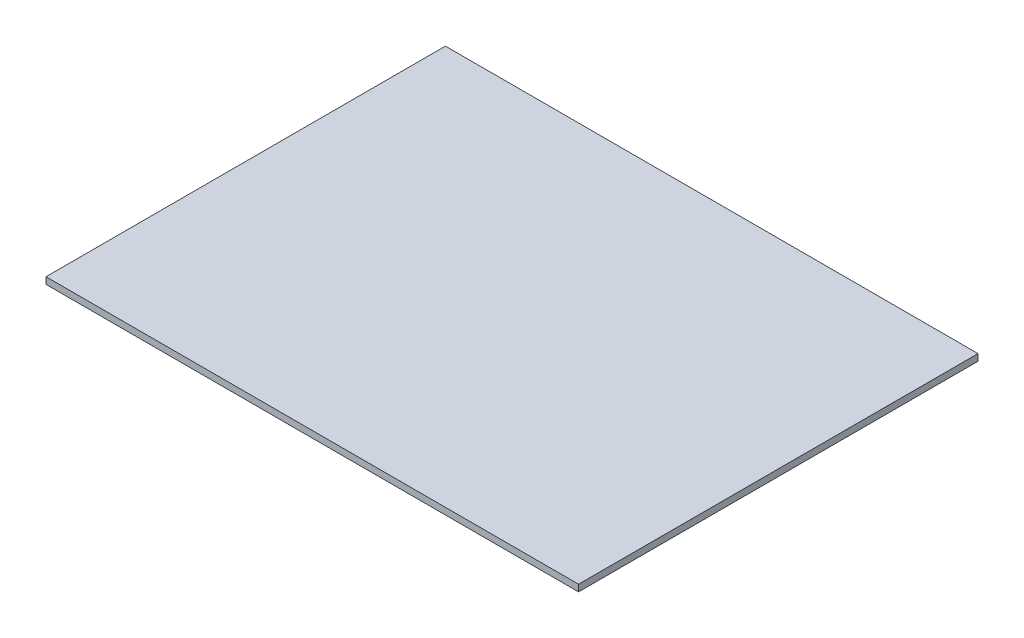
ISO-10303-21;
HEADER;
FILE_DESCRIPTION(('STEP AP214'),'2;1');
FILE_NAME('part.step','',(''),(''),'','','');
FILE_SCHEMA(('AUTOMOTIVE_DESIGN { 1 0 10303 214 1 1 1 1 }'));
ENDSEC;
DATA;
#1=APPLICATION_CONTEXT('core data for automotive mechanical design processes');
#2=APPLICATION_PROTOCOL_DEFINITION('international standard','automotive_design',2000,#1);
#3=PRODUCT_CONTEXT('',#1,'mechanical');
#4=PRODUCT('Part','Part','',(#3));
#5=PRODUCT_RELATED_PRODUCT_CATEGORY('part','',(#4));
#6=PRODUCT_DEFINITION_FORMATION('','',#4);
#7=PRODUCT_DEFINITION_CONTEXT('part definition',#1,'design');
#8=PRODUCT_DEFINITION('design','',#6,#7);
#9=PRODUCT_DEFINITION_SHAPE('','',#8);
#10=(LENGTH_UNIT() NAMED_UNIT(*) SI_UNIT(.MILLI.,.METRE.));
#11=(NAMED_UNIT(*) PLANE_ANGLE_UNIT() SI_UNIT($,.RADIAN.));
#12=(NAMED_UNIT(*) SI_UNIT($,.STERADIAN.) SOLID_ANGLE_UNIT());
#13=UNCERTAINTY_MEASURE_WITH_UNIT(LENGTH_MEASURE(1.E-05),#10,'distance_accuracy_value','');
#14=(GEOMETRIC_REPRESENTATION_CONTEXT(3) GLOBAL_UNCERTAINTY_ASSIGNED_CONTEXT((#13)) GLOBAL_UNIT_ASSIGNED_CONTEXT((#10,
#11,#12)) REPRESENTATION_CONTEXT('',''));
#15=CARTESIAN_POINT('',(0.,0.,0.));
#16=DIRECTION('',(0.,0.,1.));
#17=DIRECTION('',(1.,0.,0.));
#18=AXIS2_PLACEMENT_3D('',#15,#16,#17);
#19=CARTESIAN_POINT('',(-40.,-1.,30.));
#20=DIRECTION('',(-1.,0.,0.));
#21=DIRECTION('',(0.,0.,1.));
#22=AXIS2_PLACEMENT_3D('',#19,#20,#21);
#23=PLANE('',#22);
#24=DIRECTION('',(0.,0.,1.));
#25=VECTOR('',#24,1.);
#26=CARTESIAN_POINT('',(-40.,0.,30.));
#27=LINE('',#26,#25);
#28=CARTESIAN_POINT('',(-40.,0.,-30.));
#29=VERTEX_POINT('',#28);
#30=CARTESIAN_POINT('',(-40.,0.,30.));
#31=VERTEX_POINT('',#30);
#32=EDGE_CURVE('E109',#29,#31,#27,.T.);
#33=ORIENTED_EDGE('',*,*,#32,.F.);
#34=DIRECTION('',(0.,1.,0.));
#35=VECTOR('',#34,1.);
#36=CARTESIAN_POINT('',(-40.,-1.,-30.));
#37=LINE('',#36,#35);
#38=CARTESIAN_POINT('',(-40.,-1.,-30.));
#39=VERTEX_POINT('',#38);
#40=EDGE_CURVE('E11',#39,#29,#37,.T.);
#41=ORIENTED_EDGE('',*,*,#40,.F.);
#42=DIRECTION('',(0.,0.,1.));
#43=VECTOR('',#42,1.);
#44=CARTESIAN_POINT('',(-40.,-1.,30.));
#45=LINE('',#44,#43);
#46=CARTESIAN_POINT('',(-40.,-1.,30.));
#47=VERTEX_POINT('',#46);
#48=EDGE_CURVE('E101',#39,#47,#45,.T.);
#49=ORIENTED_EDGE('',*,*,#48,.T.);
#50=DIRECTION('',(0.,1.,0.));
#51=VECTOR('',#50,1.);
#52=CARTESIAN_POINT('',(-40.,-1.,30.));
#53=LINE('',#52,#51);
#54=EDGE_CURVE('E42',#47,#31,#53,.T.);
#55=ORIENTED_EDGE('',*,*,#54,.T.);
#56=EDGE_LOOP('',(#33,#41,#49,#55));
#57=FACE_BOUND('',#56,.T.);
#58=ADVANCED_FACE('F39',(#57),#23,.T.);
#59=CARTESIAN_POINT('',(40.,-1.,-30.));
#60=DIRECTION('',(0.,0.,-1.));
#61=DIRECTION('',(-1.,0.,0.));
#62=AXIS2_PLACEMENT_3D('',#59,#60,#61);
#63=PLANE('',#62);
#64=DIRECTION('',(-1.,0.,0.));
#65=VECTOR('',#64,1.);
#66=CARTESIAN_POINT('',(40.,0.,-30.));
#67=LINE('',#66,#65);
#68=CARTESIAN_POINT('',(40.,0.,-30.));
#69=VERTEX_POINT('',#68);
#70=EDGE_CURVE('E104',#69,#29,#67,.T.);
#71=ORIENTED_EDGE('',*,*,#70,.F.);
#72=DIRECTION('',(0.,1.,0.));
#73=VECTOR('',#72,1.);
#74=CARTESIAN_POINT('',(40.,-1.,-30.));
#75=LINE('',#74,#73);
#76=CARTESIAN_POINT('',(40.,-1.,-30.));
#77=VERTEX_POINT('',#76);
#78=EDGE_CURVE('E49',#77,#69,#75,.T.);
#79=ORIENTED_EDGE('',*,*,#78,.F.);
#80=DIRECTION('',(-1.,0.,0.));
#81=VECTOR('',#80,1.);
#82=CARTESIAN_POINT('',(40.,-1.,-30.));
#83=LINE('',#82,#81);
#84=EDGE_CURVE('E96',#77,#39,#83,.T.);
#85=ORIENTED_EDGE('',*,*,#84,.T.);
#86=ORIENTED_EDGE('',*,*,#40,.T.);
#87=EDGE_LOOP('',(#71,#79,#85,#86));
#88=FACE_BOUND('',#87,.T.);
#89=ADVANCED_FACE('F125',(#88),#63,.T.);
#90=CARTESIAN_POINT('',(40.,-1.,30.));
#91=DIRECTION('',(1.,0.,0.));
#92=DIRECTION('',(0.,0.,-1.));
#93=AXIS2_PLACEMENT_3D('',#90,#91,#92);
#94=PLANE('',#93);
#95=DIRECTION('',(0.,0.,-1.));
#96=VECTOR('',#95,1.);
#97=CARTESIAN_POINT('',(40.,0.,30.));
#98=LINE('',#97,#96);
#99=CARTESIAN_POINT('',(40.,0.,30.));
#100=VERTEX_POINT('',#99);
#101=EDGE_CURVE('E90',#100,#69,#98,.T.);
#102=ORIENTED_EDGE('',*,*,#101,.F.);
#103=DIRECTION('',(0.,1.,0.));
#104=VECTOR('',#103,1.);
#105=CARTESIAN_POINT('',(40.,-1.,30.));
#106=LINE('',#105,#104);
#107=CARTESIAN_POINT('',(40.,-1.,30.));
#108=VERTEX_POINT('',#107);
#109=EDGE_CURVE('E85',#108,#100,#106,.T.);
#110=ORIENTED_EDGE('',*,*,#109,.F.);
#111=DIRECTION('',(0.,0.,-1.));
#112=VECTOR('',#111,1.);
#113=CARTESIAN_POINT('',(40.,-1.,30.));
#114=LINE('',#113,#112);
#115=EDGE_CURVE('E88',#108,#77,#114,.T.);
#116=ORIENTED_EDGE('',*,*,#115,.T.);
#117=ORIENTED_EDGE('',*,*,#78,.T.);
#118=EDGE_LOOP('',(#102,#110,#116,#117));
#119=FACE_BOUND('',#118,.T.);
#120=ADVANCED_FACE('F87',(#119),#94,.T.);
#121=CARTESIAN_POINT('',(40.,-1.,30.));
#122=DIRECTION('',(0.,0.,1.));
#123=DIRECTION('',(1.,0.,0.));
#124=AXIS2_PLACEMENT_3D('',#121,#122,#123);
#125=PLANE('',#124);
#126=DIRECTION('',(1.,0.,0.));
#127=VECTOR('',#126,1.);
#128=CARTESIAN_POINT('',(40.,0.,30.));
#129=LINE('',#128,#127);
#130=EDGE_CURVE('E113',#31,#100,#129,.T.);
#131=ORIENTED_EDGE('',*,*,#130,.F.);
#132=ORIENTED_EDGE('',*,*,#54,.F.);
#133=DIRECTION('',(1.,0.,0.));
#134=VECTOR('',#133,1.);
#135=CARTESIAN_POINT('',(40.,-1.,30.));
#136=LINE('',#135,#134);
#137=EDGE_CURVE('E95',#47,#108,#136,.T.);
#138=ORIENTED_EDGE('',*,*,#137,.T.);
#139=ORIENTED_EDGE('',*,*,#109,.T.);
#140=EDGE_LOOP('',(#131,#132,#138,#139));
#141=FACE_BOUND('',#140,.T.);
#142=ADVANCED_FACE('F99',(#141),#125,.T.);
#143=CARTESIAN_POINT('',(0.,-1.,0.));
#144=DIRECTION('',(0.,1.,0.));
#145=DIRECTION('',(0.,0.,1.));
#146=AXIS2_PLACEMENT_3D('',#143,#144,#145);
#147=PLANE('',#146);
#148=ORIENTED_EDGE('',*,*,#48,.F.);
#149=ORIENTED_EDGE('',*,*,#84,.F.);
#150=ORIENTED_EDGE('',*,*,#115,.F.);
#151=ORIENTED_EDGE('',*,*,#137,.F.);
#152=EDGE_LOOP('',(#148,#149,#150,#151));
#153=FACE_BOUND('',#152,.T.);
#154=ADVANCED_FACE('F94',(#153),#147,.F.);
#155=CARTESIAN_POINT('',(0.,0.,0.));
#156=DIRECTION('',(0.,1.,0.));
#157=DIRECTION('',(0.,0.,1.));
#158=AXIS2_PLACEMENT_3D('',#155,#156,#157);
#159=PLANE('',#158);
#160=ORIENTED_EDGE('',*,*,#32,.T.);
#161=ORIENTED_EDGE('',*,*,#130,.T.);
#162=ORIENTED_EDGE('',*,*,#101,.T.);
#163=ORIENTED_EDGE('',*,*,#70,.T.);
#164=EDGE_LOOP('',(#160,#161,#162,#163));
#165=FACE_BOUND('',#164,.T.);
#166=ADVANCED_FACE('F124',(#165),#159,.T.);
#167=CLOSED_SHELL('',(#58,#89,#120,#142,#154,#166));
#168=MANIFOLD_SOLID_BREP('B2',#167);
#169=ADVANCED_BREP_SHAPE_REPRESENTATION('',(#18,#168),#14);
#170=SHAPE_DEFINITION_REPRESENTATION(#9,#169);
ENDSEC;
END-ISO-10303-21;
